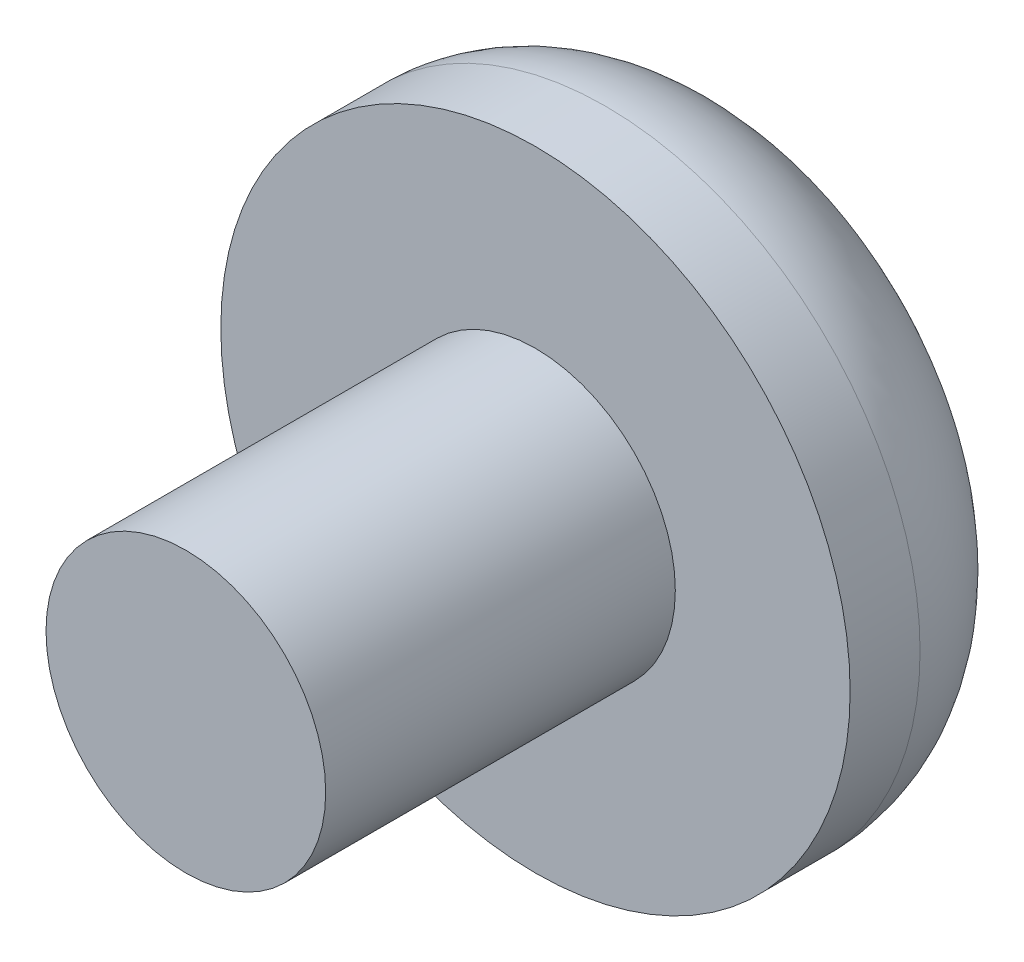
ISO-10303-21;
HEADER;
FILE_DESCRIPTION(('STEP AP214'),'2;1');
FILE_NAME('part.step','',(''),(''),'','','');
FILE_SCHEMA(('AUTOMOTIVE_DESIGN { 1 0 10303 214 1 1 1 1 }'));
ENDSEC;
DATA;
#1=APPLICATION_CONTEXT('core data for automotive mechanical design processes');
#2=APPLICATION_PROTOCOL_DEFINITION('international standard','automotive_design',2000,#1);
#3=PRODUCT_CONTEXT('',#1,'mechanical');
#4=PRODUCT('Part','Part','',(#3));
#5=PRODUCT_RELATED_PRODUCT_CATEGORY('part','',(#4));
#6=PRODUCT_DEFINITION_FORMATION('','',#4);
#7=PRODUCT_DEFINITION_CONTEXT('part definition',#1,'design');
#8=PRODUCT_DEFINITION('design','',#6,#7);
#9=PRODUCT_DEFINITION_SHAPE('','',#8);
#10=(LENGTH_UNIT() NAMED_UNIT(*) SI_UNIT(.MILLI.,.METRE.));
#11=(NAMED_UNIT(*) PLANE_ANGLE_UNIT() SI_UNIT($,.RADIAN.));
#12=(NAMED_UNIT(*) SI_UNIT($,.STERADIAN.) SOLID_ANGLE_UNIT());
#13=UNCERTAINTY_MEASURE_WITH_UNIT(LENGTH_MEASURE(1.E-05),#10,'distance_accuracy_value','');
#14=(GEOMETRIC_REPRESENTATION_CONTEXT(3) GLOBAL_UNCERTAINTY_ASSIGNED_CONTEXT((#13)) GLOBAL_UNIT_ASSIGNED_CONTEXT((#10,
#11,#12)) REPRESENTATION_CONTEXT('',''));
#15=CARTESIAN_POINT('',(0.,0.,0.));
#16=DIRECTION('',(0.,0.,1.));
#17=DIRECTION('',(1.,0.,0.));
#18=AXIS2_PLACEMENT_3D('',#15,#16,#17);
#19=CARTESIAN_POINT('',(0.,0.,5.));
#20=DIRECTION('',(0.,0.,-1.));
#21=DIRECTION('',(-1.,0.,0.));
#22=AXIS2_PLACEMENT_3D('',#19,#20,#21);
#23=CYLINDRICAL_SURFACE('',#22,2.);
#24=CARTESIAN_POINT('',(0.,0.,5.));
#25=DIRECTION('',(0.,0.,1.));
#26=DIRECTION('',(1.,0.,0.));
#27=AXIS2_PLACEMENT_3D('',#24,#25,#26);
#28=CIRCLE('',#27,2.);
#29=CARTESIAN_POINT('',(2.,0.,5.));
#30=VERTEX_POINT('',#29);
#31=EDGE_CURVE('E232',#30,#30,#28,.T.);
#32=ORIENTED_EDGE('',*,*,#31,.F.);
#33=EDGE_LOOP('',(#32));
#34=FACE_BOUND('',#33,.T.);
#35=CARTESIAN_POINT('',(0.,0.,0.));
#36=DIRECTION('',(0.,0.,1.));
#37=DIRECTION('',(1.,0.,0.));
#38=AXIS2_PLACEMENT_3D('',#35,#36,#37);
#39=CIRCLE('',#38,2.);
#40=CARTESIAN_POINT('',(2.,0.,0.));
#41=VERTEX_POINT('',#40);
#42=EDGE_CURVE('E204',#41,#41,#39,.T.);
#43=ORIENTED_EDGE('',*,*,#42,.T.);
#44=EDGE_LOOP('',(#43));
#45=FACE_BOUND('',#44,.T.);
#46=ADVANCED_FACE('F49',(#34,#45),#23,.T.);
#47=CARTESIAN_POINT('',(0.,0.,5.));
#48=DIRECTION('',(0.,0.,1.));
#49=DIRECTION('',(1.,0.,0.));
#50=AXIS2_PLACEMENT_3D('',#47,#48,#49);
#51=PLANE('',#50);
#52=ORIENTED_EDGE('',*,*,#31,.T.);
#53=EDGE_LOOP('',(#52));
#54=FACE_BOUND('',#53,.T.);
#55=ADVANCED_FACE('F252',(#54),#51,.T.);
#56=CARTESIAN_POINT('',(0.,0.,0.));
#57=DIRECTION('',(0.,0.,1.));
#58=DIRECTION('',(1.,0.,0.));
#59=AXIS2_PLACEMENT_3D('',#56,#57,#58);
#60=PLANE('',#59);
#61=CARTESIAN_POINT('',(0.,0.,0.));
#62=DIRECTION('',(0.,0.,1.));
#63=DIRECTION('',(1.,0.,0.));
#64=AXIS2_PLACEMENT_3D('',#61,#62,#63);
#65=CIRCLE('',#64,4.5);
#66=CARTESIAN_POINT('',(4.5,0.,0.));
#67=VERTEX_POINT('',#66);
#68=EDGE_CURVE('E157',#67,#67,#65,.T.);
#69=ORIENTED_EDGE('',*,*,#68,.T.);
#70=EDGE_LOOP('',(#69));
#71=FACE_BOUND('',#70,.T.);
#72=ORIENTED_EDGE('',*,*,#42,.F.);
#73=EDGE_LOOP('',(#72));
#74=FACE_BOUND('',#73,.T.);
#75=ADVANCED_FACE('F257',(#71,#74),#60,.T.);
#76=CARTESIAN_POINT('',(0.115769453402899,0.,-3.));
#77=DIRECTION('',(1.,0.,0.));
#78=DIRECTION('',(0.,0.,-1.));
#79=AXIS2_PLACEMENT_3D('',#76,#77,#78);
#80=PLANE('',#79);
#81=DIRECTION('',(0.,1.,0.));
#82=VECTOR('',#81,1.);
#83=CARTESIAN_POINT('',(0.115769453402899,0.,0.));
#84=LINE('',#83,#82);
#85=CARTESIAN_POINT('',(0.115769453402899,-1.71873111590303,0.));
#86=VERTEX_POINT('',#85);
#87=CARTESIAN_POINT('',(0.115769453402899,-0.115769453402899,0.));
#88=VERTEX_POINT('',#87);
#89=EDGE_CURVE('E64',#86,#88,#84,.T.);
#90=ORIENTED_EDGE('',*,*,#89,.T.);
#91=DIRECTION('',(0.,0.,1.));
#92=VECTOR('',#91,1.);
#93=CARTESIAN_POINT('',(0.115769453402899,-0.115769453402899,-3.));
#94=LINE('',#93,#92);
#95=CARTESIAN_POINT('',(0.115769453402899,-0.115769453402899,-3.));
#96=VERTEX_POINT('',#95);
#97=EDGE_CURVE('E156',#96,#88,#94,.T.);
#98=ORIENTED_EDGE('',*,*,#97,.F.);
#99=DIRECTION('',(0.,1.,0.));
#100=VECTOR('',#99,1.);
#101=CARTESIAN_POINT('',(0.115769453402899,0.,-3.));
#102=LINE('',#101,#100);
#103=CARTESIAN_POINT('',(0.115769453402899,-1.71873111590303,-3.));
#104=VERTEX_POINT('',#103);
#105=EDGE_CURVE('E141',#104,#96,#102,.T.);
#106=ORIENTED_EDGE('',*,*,#105,.F.);
#107=DIRECTION('',(0.,0.,1.));
#108=VECTOR('',#107,1.);
#109=CARTESIAN_POINT('',(0.115769453402899,-1.71873111590303,-3.));
#110=LINE('',#109,#108);
#111=EDGE_CURVE('E148',#104,#86,#110,.T.);
#112=ORIENTED_EDGE('',*,*,#111,.T.);
#113=EDGE_LOOP('',(#90,#98,#106,#112));
#114=FACE_BOUND('',#113,.T.);
#115=ADVANCED_FACE('F154',(#114),#80,.F.);
#116=CARTESIAN_POINT('',(0.,-0.115769453402899,-3.));
#117=DIRECTION('',(0.,-1.,0.));
#118=DIRECTION('',(0.,0.,-1.));
#119=AXIS2_PLACEMENT_3D('',#116,#117,#118);
#120=PLANE('',#119);
#121=DIRECTION('',(1.,0.,0.));
#122=VECTOR('',#121,1.);
#123=CARTESIAN_POINT('',(0.,-0.115769453402899,0.));
#124=LINE('',#123,#122);
#125=CARTESIAN_POINT('',(1.71873111590303,-0.115769453402899,0.));
#126=VERTEX_POINT('',#125);
#127=EDGE_CURVE('E161',#88,#126,#124,.T.);
#128=ORIENTED_EDGE('',*,*,#127,.T.);
#129=DIRECTION('',(0.,0.,1.));
#130=VECTOR('',#129,1.);
#131=CARTESIAN_POINT('',(1.71873111590303,-0.115769453402899,-3.));
#132=LINE('',#131,#130);
#133=CARTESIAN_POINT('',(1.71873111590303,-0.115769453402899,-3.));
#134=VERTEX_POINT('',#133);
#135=EDGE_CURVE('E205',#134,#126,#132,.T.);
#136=ORIENTED_EDGE('',*,*,#135,.F.);
#137=DIRECTION('',(1.,0.,0.));
#138=VECTOR('',#137,1.);
#139=CARTESIAN_POINT('',(0.,-0.115769453402899,-3.));
#140=LINE('',#139,#138);
#141=EDGE_CURVE('E152',#96,#134,#140,.T.);
#142=ORIENTED_EDGE('',*,*,#141,.F.);
#143=ORIENTED_EDGE('',*,*,#97,.T.);
#144=EDGE_LOOP('',(#128,#136,#142,#143));
#145=FACE_BOUND('',#144,.T.);
#146=ADVANCED_FACE('F290',(#145),#120,.F.);
#147=CARTESIAN_POINT('',(1.71873111590303,0.,-3.));
#148=DIRECTION('',(-1.,0.,0.));
#149=DIRECTION('',(0.,0.,1.));
#150=AXIS2_PLACEMENT_3D('',#147,#148,#149);
#151=PLANE('',#150);
#152=DIRECTION('',(0.,-1.,0.));
#153=VECTOR('',#152,1.);
#154=CARTESIAN_POINT('',(1.71873111590303,0.,0.));
#155=LINE('',#154,#153);
#156=CARTESIAN_POINT('',(1.71873111590303,0.115769453402899,0.));
#157=VERTEX_POINT('',#156);
#158=EDGE_CURVE('E201',#157,#126,#155,.T.);
#159=ORIENTED_EDGE('',*,*,#158,.F.);
#160=DIRECTION('',(0.,0.,1.));
#161=VECTOR('',#160,1.);
#162=CARTESIAN_POINT('',(1.71873111590303,0.115769453402899,-3.));
#163=LINE('',#162,#161);
#164=CARTESIAN_POINT('',(1.71873111590303,0.115769453402899,-3.));
#165=VERTEX_POINT('',#164);
#166=EDGE_CURVE('E208',#165,#157,#163,.T.);
#167=ORIENTED_EDGE('',*,*,#166,.F.);
#168=DIRECTION('',(0.,-1.,0.));
#169=VECTOR('',#168,1.);
#170=CARTESIAN_POINT('',(1.71873111590303,0.,-3.));
#171=LINE('',#170,#169);
#172=EDGE_CURVE('E170',#165,#134,#171,.T.);
#173=ORIENTED_EDGE('',*,*,#172,.T.);
#174=ORIENTED_EDGE('',*,*,#135,.T.);
#175=EDGE_LOOP('',(#159,#167,#173,#174));
#176=FACE_BOUND('',#175,.T.);
#177=ADVANCED_FACE('F286',(#176),#151,.T.);
#178=CARTESIAN_POINT('',(0.,0.115769453402899,-3.));
#179=DIRECTION('',(0.,-1.,0.));
#180=DIRECTION('',(0.,0.,-1.));
#181=AXIS2_PLACEMENT_3D('',#178,#179,#180);
#182=PLANE('',#181);
#183=DIRECTION('',(1.,0.,0.));
#184=VECTOR('',#183,1.);
#185=CARTESIAN_POINT('',(0.,0.115769453402899,0.));
#186=LINE('',#185,#184);
#187=CARTESIAN_POINT('',(0.115769453402899,0.115769453402899,0.));
#188=VERTEX_POINT('',#187);
#189=EDGE_CURVE('E198',#188,#157,#186,.T.);
#190=ORIENTED_EDGE('',*,*,#189,.F.);
#191=DIRECTION('',(0.,0.,1.));
#192=VECTOR('',#191,1.);
#193=CARTESIAN_POINT('',(0.115769453402899,0.115769453402899,-3.));
#194=LINE('',#193,#192);
#195=CARTESIAN_POINT('',(0.115769453402899,0.115769453402899,-3.));
#196=VERTEX_POINT('',#195);
#197=EDGE_CURVE('E211',#196,#188,#194,.T.);
#198=ORIENTED_EDGE('',*,*,#197,.F.);
#199=DIRECTION('',(1.,0.,0.));
#200=VECTOR('',#199,1.);
#201=CARTESIAN_POINT('',(0.,0.115769453402899,-3.));
#202=LINE('',#201,#200);
#203=EDGE_CURVE('E163',#196,#165,#202,.T.);
#204=ORIENTED_EDGE('',*,*,#203,.T.);
#205=ORIENTED_EDGE('',*,*,#166,.T.);
#206=EDGE_LOOP('',(#190,#198,#204,#205));
#207=FACE_BOUND('',#206,.T.);
#208=ADVANCED_FACE('F282',(#207),#182,.T.);
#209=CARTESIAN_POINT('',(0.115769453402899,1.71873111590303,0.));
#210=VERTEX_POINT('',#209);
#211=EDGE_CURVE('E185',#188,#210,#84,.T.);
#212=ORIENTED_EDGE('',*,*,#211,.T.);
#213=DIRECTION('',(0.,0.,1.));
#214=VECTOR('',#213,1.);
#215=CARTESIAN_POINT('',(0.115769453402899,1.71873111590303,-3.));
#216=LINE('',#215,#214);
#217=CARTESIAN_POINT('',(0.115769453402899,1.71873111590303,-3.));
#218=VERTEX_POINT('',#217);
#219=EDGE_CURVE('E214',#218,#210,#216,.T.);
#220=ORIENTED_EDGE('',*,*,#219,.F.);
#221=EDGE_CURVE('E159',#196,#218,#102,.T.);
#222=ORIENTED_EDGE('',*,*,#221,.F.);
#223=ORIENTED_EDGE('',*,*,#197,.T.);
#224=EDGE_LOOP('',(#212,#220,#222,#223));
#225=FACE_BOUND('',#224,.T.);
#226=ADVANCED_FACE('F279',(#225),#80,.F.);
#227=CARTESIAN_POINT('',(0.,1.71873111590303,-3.));
#228=DIRECTION('',(0.,-1.,0.));
#229=DIRECTION('',(0.,0.,-1.));
#230=AXIS2_PLACEMENT_3D('',#227,#228,#229);
#231=PLANE('',#230);
#232=DIRECTION('',(1.,0.,0.));
#233=VECTOR('',#232,1.);
#234=CARTESIAN_POINT('',(0.,1.71873111590303,0.));
#235=LINE('',#234,#233);
#236=CARTESIAN_POINT('',(-0.115769453402899,1.71873111590303,0.));
#237=VERTEX_POINT('',#236);
#238=EDGE_CURVE('E199',#237,#210,#235,.T.);
#239=ORIENTED_EDGE('',*,*,#238,.F.);
#240=DIRECTION('',(0.,0.,1.));
#241=VECTOR('',#240,1.);
#242=CARTESIAN_POINT('',(-0.115769453402899,1.71873111590303,-3.));
#243=LINE('',#242,#241);
#244=CARTESIAN_POINT('',(-0.115769453402899,1.71873111590303,-3.));
#245=VERTEX_POINT('',#244);
#246=EDGE_CURVE('E216',#245,#237,#243,.T.);
#247=ORIENTED_EDGE('',*,*,#246,.F.);
#248=DIRECTION('',(1.,0.,0.));
#249=VECTOR('',#248,1.);
#250=CARTESIAN_POINT('',(0.,1.71873111590303,-3.));
#251=LINE('',#250,#249);
#252=EDGE_CURVE('E164',#245,#218,#251,.T.);
#253=ORIENTED_EDGE('',*,*,#252,.T.);
#254=ORIENTED_EDGE('',*,*,#219,.T.);
#255=EDGE_LOOP('',(#239,#247,#253,#254));
#256=FACE_BOUND('',#255,.T.);
#257=ADVANCED_FACE('F275',(#256),#231,.T.);
#258=CARTESIAN_POINT('',(-0.115769453402899,0.,-3.));
#259=DIRECTION('',(1.,0.,0.));
#260=DIRECTION('',(0.,0.,-1.));
#261=AXIS2_PLACEMENT_3D('',#258,#259,#260);
#262=PLANE('',#261);
#263=DIRECTION('',(0.,1.,0.));
#264=VECTOR('',#263,1.);
#265=CARTESIAN_POINT('',(-0.115769453402899,0.,0.));
#266=LINE('',#265,#264);
#267=CARTESIAN_POINT('',(-0.115769453402899,0.115769453402899,0.));
#268=VERTEX_POINT('',#267);
#269=EDGE_CURVE('E190',#268,#237,#266,.T.);
#270=ORIENTED_EDGE('',*,*,#269,.F.);
#271=DIRECTION('',(0.,0.,1.));
#272=VECTOR('',#271,1.);
#273=CARTESIAN_POINT('',(-0.115769453402899,0.115769453402899,-3.));
#274=LINE('',#273,#272);
#275=CARTESIAN_POINT('',(-0.115769453402899,0.115769453402899,-3.));
#276=VERTEX_POINT('',#275);
#277=EDGE_CURVE('E219',#276,#268,#274,.T.);
#278=ORIENTED_EDGE('',*,*,#277,.F.);
#279=DIRECTION('',(0.,1.,0.));
#280=VECTOR('',#279,1.);
#281=CARTESIAN_POINT('',(-0.115769453402899,0.,-3.));
#282=LINE('',#281,#280);
#283=EDGE_CURVE('E174',#276,#245,#282,.T.);
#284=ORIENTED_EDGE('',*,*,#283,.T.);
#285=ORIENTED_EDGE('',*,*,#246,.T.);
#286=EDGE_LOOP('',(#270,#278,#284,#285));
#287=FACE_BOUND('',#286,.T.);
#288=ADVANCED_FACE('F272',(#287),#262,.T.);
#289=CARTESIAN_POINT('',(-1.71873111590303,0.115769453402899,0.));
#290=VERTEX_POINT('',#289);
#291=EDGE_CURVE('E196',#290,#268,#186,.T.);
#292=ORIENTED_EDGE('',*,*,#291,.F.);
#293=DIRECTION('',(0.,0.,1.));
#294=VECTOR('',#293,1.);
#295=CARTESIAN_POINT('',(-1.71873111590303,0.115769453402899,-3.));
#296=LINE('',#295,#294);
#297=CARTESIAN_POINT('',(-1.71873111590303,0.115769453402899,-3.));
#298=VERTEX_POINT('',#297);
#299=EDGE_CURVE('E222',#298,#290,#296,.T.);
#300=ORIENTED_EDGE('',*,*,#299,.F.);
#301=EDGE_CURVE('E172',#298,#276,#202,.T.);
#302=ORIENTED_EDGE('',*,*,#301,.T.);
#303=ORIENTED_EDGE('',*,*,#277,.T.);
#304=EDGE_LOOP('',(#292,#300,#302,#303));
#305=FACE_BOUND('',#304,.T.);
#306=ADVANCED_FACE('F270',(#305),#182,.T.);
#307=CARTESIAN_POINT('',(-1.71873111590303,0.,-3.));
#308=DIRECTION('',(-1.,0.,0.));
#309=DIRECTION('',(0.,0.,1.));
#310=AXIS2_PLACEMENT_3D('',#307,#308,#309);
#311=PLANE('',#310);
#312=DIRECTION('',(0.,-1.,0.));
#313=VECTOR('',#312,1.);
#314=CARTESIAN_POINT('',(-1.71873111590303,0.,0.));
#315=LINE('',#314,#313);
#316=CARTESIAN_POINT('',(-1.71873111590303,-0.115769453402899,0.));
#317=VERTEX_POINT('',#316);
#318=EDGE_CURVE('E193',#290,#317,#315,.T.);
#319=ORIENTED_EDGE('',*,*,#318,.T.);
#320=DIRECTION('',(0.,0.,1.));
#321=VECTOR('',#320,1.);
#322=CARTESIAN_POINT('',(-1.71873111590303,-0.115769453402899,-3.));
#323=LINE('',#322,#321);
#324=CARTESIAN_POINT('',(-1.71873111590303,-0.115769453402899,-3.));
#325=VERTEX_POINT('',#324);
#326=EDGE_CURVE('E225',#325,#317,#323,.T.);
#327=ORIENTED_EDGE('',*,*,#326,.F.);
#328=DIRECTION('',(0.,-1.,0.));
#329=VECTOR('',#328,1.);
#330=CARTESIAN_POINT('',(-1.71873111590303,0.,-3.));
#331=LINE('',#330,#329);
#332=EDGE_CURVE('E435',#298,#325,#331,.T.);
#333=ORIENTED_EDGE('',*,*,#332,.F.);
#334=ORIENTED_EDGE('',*,*,#299,.T.);
#335=EDGE_LOOP('',(#319,#327,#333,#334));
#336=FACE_BOUND('',#335,.T.);
#337=ADVANCED_FACE('F266',(#336),#311,.F.);
#338=CARTESIAN_POINT('',(-0.115769453402899,-0.115769453402899,0.));
#339=VERTEX_POINT('',#338);
#340=EDGE_CURVE('E189',#317,#339,#124,.T.);
#341=ORIENTED_EDGE('',*,*,#340,.T.);
#342=DIRECTION('',(0.,0.,1.));
#343=VECTOR('',#342,1.);
#344=CARTESIAN_POINT('',(-0.115769453402899,-0.115769453402899,-3.));
#345=LINE('',#344,#343);
#346=CARTESIAN_POINT('',(-0.115769453402899,-0.115769453402899,-3.));
#347=VERTEX_POINT('',#346);
#348=EDGE_CURVE('E228',#347,#339,#345,.T.);
#349=ORIENTED_EDGE('',*,*,#348,.F.);
#350=EDGE_CURVE('E438',#325,#347,#140,.T.);
#351=ORIENTED_EDGE('',*,*,#350,.F.);
#352=ORIENTED_EDGE('',*,*,#326,.T.);
#353=EDGE_LOOP('',(#341,#349,#351,#352));
#354=FACE_BOUND('',#353,.T.);
#355=ADVANCED_FACE('F269',(#354),#120,.F.);
#356=CARTESIAN_POINT('',(-0.115769453402899,-1.71873111590303,0.));
#357=VERTEX_POINT('',#356);
#358=EDGE_CURVE('E187',#357,#339,#266,.T.);
#359=ORIENTED_EDGE('',*,*,#358,.F.);
#360=DIRECTION('',(0.,0.,1.));
#361=VECTOR('',#360,1.);
#362=CARTESIAN_POINT('',(-0.115769453402899,-1.71873111590303,-3.));
#363=LINE('',#362,#361);
#364=CARTESIAN_POINT('',(-0.115769453402899,-1.71873111590303,-3.));
#365=VERTEX_POINT('',#364);
#366=EDGE_CURVE('E151',#365,#357,#363,.T.);
#367=ORIENTED_EDGE('',*,*,#366,.F.);
#368=EDGE_CURVE('E144',#365,#347,#282,.T.);
#369=ORIENTED_EDGE('',*,*,#368,.T.);
#370=ORIENTED_EDGE('',*,*,#348,.T.);
#371=EDGE_LOOP('',(#359,#367,#369,#370));
#372=FACE_BOUND('',#371,.T.);
#373=ADVANCED_FACE('F265',(#372),#262,.T.);
#374=CARTESIAN_POINT('',(0.,-1.71873111590303,-3.));
#375=DIRECTION('',(0.,-1.,0.));
#376=DIRECTION('',(0.,0.,-1.));
#377=AXIS2_PLACEMENT_3D('',#374,#375,#376);
#378=PLANE('',#377);
#379=DIRECTION('',(1.,0.,0.));
#380=VECTOR('',#379,1.);
#381=CARTESIAN_POINT('',(0.,-1.71873111590303,0.));
#382=LINE('',#381,#380);
#383=EDGE_CURVE('E68',#357,#86,#382,.T.);
#384=ORIENTED_EDGE('',*,*,#383,.T.);
#385=ORIENTED_EDGE('',*,*,#111,.F.);
#386=DIRECTION('',(1.,0.,0.));
#387=VECTOR('',#386,1.);
#388=CARTESIAN_POINT('',(0.,-1.71873111590303,-3.));
#389=LINE('',#388,#387);
#390=EDGE_CURVE('E137',#365,#104,#389,.T.);
#391=ORIENTED_EDGE('',*,*,#390,.F.);
#392=ORIENTED_EDGE('',*,*,#366,.T.);
#393=EDGE_LOOP('',(#384,#385,#391,#392));
#394=FACE_BOUND('',#393,.T.);
#395=ADVANCED_FACE('F149',(#394),#378,.F.);
#396=CARTESIAN_POINT('',(0.,0.,-3.));
#397=DIRECTION('',(0.,0.,1.));
#398=DIRECTION('',(1.,0.,0.));
#399=AXIS2_PLACEMENT_3D('',#396,#397,#398);
#400=CYLINDRICAL_SURFACE('',#399,4.5);
#401=CARTESIAN_POINT('',(0.,0.,-1.));
#402=DIRECTION('',(0.,0.,1.));
#403=DIRECTION('',(1.,0.,0.));
#404=AXIS2_PLACEMENT_3D('',#401,#402,#403);
#405=CIRCLE('',#404,4.5);
#406=CARTESIAN_POINT('',(4.5,0.,-1.));
#407=VERTEX_POINT('',#406);
#408=EDGE_CURVE('E57',#407,#407,#405,.T.);
#409=ORIENTED_EDGE('',*,*,#408,.T.);
#410=EDGE_LOOP('',(#409));
#411=FACE_BOUND('',#410,.T.);
#412=ORIENTED_EDGE('',*,*,#68,.F.);
#413=EDGE_LOOP('',(#412));
#414=FACE_BOUND('',#413,.T.);
#415=ADVANCED_FACE('F239',(#411,#414),#400,.T.);
#416=CARTESIAN_POINT('',(0.,0.,-3.));
#417=DIRECTION('',(0.,0.,1.));
#418=DIRECTION('',(1.,0.,0.));
#419=AXIS2_PLACEMENT_3D('',#416,#417,#418);
#420=PLANE('',#419);
#421=CARTESIAN_POINT('',(0.,0.,-3.));
#422=DIRECTION('',(0.,0.,1.));
#423=DIRECTION('',(1.,0.,0.));
#424=AXIS2_PLACEMENT_3D('',#421,#422,#423);
#425=CIRCLE('',#424,2.5);
#426=CARTESIAN_POINT('',(2.5,0.,-3.));
#427=VERTEX_POINT('',#426);
#428=EDGE_CURVE('E11',#427,#427,#425,.F.);
#429=ORIENTED_EDGE('',*,*,#428,.T.);
#430=EDGE_LOOP('',(#429));
#431=FACE_BOUND('',#430,.T.);
#432=ORIENTED_EDGE('',*,*,#105,.T.);
#433=ORIENTED_EDGE('',*,*,#141,.T.);
#434=ORIENTED_EDGE('',*,*,#172,.F.);
#435=ORIENTED_EDGE('',*,*,#203,.F.);
#436=ORIENTED_EDGE('',*,*,#221,.T.);
#437=ORIENTED_EDGE('',*,*,#252,.F.);
#438=ORIENTED_EDGE('',*,*,#283,.F.);
#439=ORIENTED_EDGE('',*,*,#301,.F.);
#440=ORIENTED_EDGE('',*,*,#332,.T.);
#441=ORIENTED_EDGE('',*,*,#350,.T.);
#442=ORIENTED_EDGE('',*,*,#368,.F.);
#443=ORIENTED_EDGE('',*,*,#390,.T.);
#444=EDGE_LOOP('',(#432,#433,#434,#435,#436,#437,#438,#439,#440,#441,#442,#443));
#445=FACE_BOUND('',#444,.T.);
#446=ADVANCED_FACE('F139',(#431,#445),#420,.F.);
#447=CARTESIAN_POINT('',(0.,0.,0.));
#448=DIRECTION('',(0.,0.,1.));
#449=DIRECTION('',(1.,0.,0.));
#450=AXIS2_PLACEMENT_3D('',#447,#448,#449);
#451=PLANE('',#450);
#452=ORIENTED_EDGE('',*,*,#89,.F.);
#453=ORIENTED_EDGE('',*,*,#383,.F.);
#454=ORIENTED_EDGE('',*,*,#358,.T.);
#455=ORIENTED_EDGE('',*,*,#340,.F.);
#456=ORIENTED_EDGE('',*,*,#318,.F.);
#457=ORIENTED_EDGE('',*,*,#291,.T.);
#458=ORIENTED_EDGE('',*,*,#269,.T.);
#459=ORIENTED_EDGE('',*,*,#238,.T.);
#460=ORIENTED_EDGE('',*,*,#211,.F.);
#461=ORIENTED_EDGE('',*,*,#189,.T.);
#462=ORIENTED_EDGE('',*,*,#158,.T.);
#463=ORIENTED_EDGE('',*,*,#127,.F.);
#464=EDGE_LOOP('',(#452,#453,#454,#455,#456,#457,#458,#459,#460,#461,#462,#463));
#465=FACE_BOUND('',#464,.T.);
#466=ADVANCED_FACE('F243',(#465),#451,.F.);
#467=CARTESIAN_POINT('',(0.,0.,-1.));
#468=DIRECTION('',(0.,0.,1.));
#469=DIRECTION('',(1.,0.,0.));
#470=AXIS2_PLACEMENT_3D('',#467,#468,#469);
#471=TOROIDAL_SURFACE('',#470,2.5,2.);
#472=ORIENTED_EDGE('',*,*,#428,.F.);
#473=EDGE_LOOP('',(#472));
#474=FACE_BOUND('',#473,.T.);
#475=ORIENTED_EDGE('',*,*,#408,.F.);
#476=EDGE_LOOP('',(#475));
#477=FACE_BOUND('',#476,.T.);
#478=ADVANCED_FACE('F51',(#474,#477),#471,.T.);
#479=CLOSED_SHELL('',(#46,#55,#75,#115,#146,#177,#208,#226,#257,#288,#306,#337,#355,#373,#395,
#415,#446,#466,#478));
#480=MANIFOLD_SOLID_BREP('B2',#479);
#481=ADVANCED_BREP_SHAPE_REPRESENTATION('',(#18,#480),#14);
#482=SHAPE_DEFINITION_REPRESENTATION(#9,#481);
ENDSEC;
END-ISO-10303-21;
